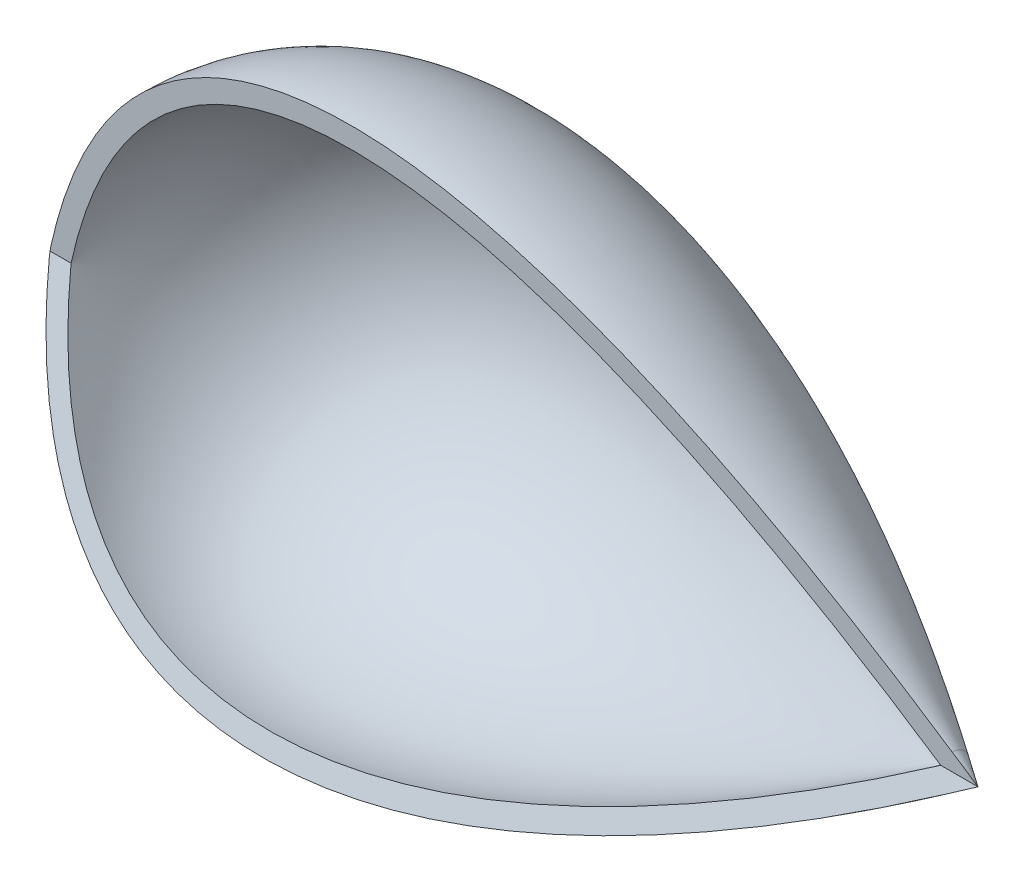
ISO-10303-21;
HEADER;
FILE_DESCRIPTION(('STEP AP214'),'2;1');
FILE_NAME('part.step','',(''),(''),'','','');
FILE_SCHEMA(('AUTOMOTIVE_DESIGN { 1 0 10303 214 1 1 1 1 }'));
ENDSEC;
DATA;
#1=APPLICATION_CONTEXT('core data for automotive mechanical design processes');
#2=APPLICATION_PROTOCOL_DEFINITION('international standard','automotive_design',2000,#1);
#3=PRODUCT_CONTEXT('',#1,'mechanical');
#4=PRODUCT('Part','Part','',(#3));
#5=PRODUCT_RELATED_PRODUCT_CATEGORY('part','',(#4));
#6=PRODUCT_DEFINITION_FORMATION('','',#4);
#7=PRODUCT_DEFINITION_CONTEXT('part definition',#1,'design');
#8=PRODUCT_DEFINITION('design','',#6,#7);
#9=PRODUCT_DEFINITION_SHAPE('','',#8);
#10=(LENGTH_UNIT() NAMED_UNIT(*) SI_UNIT(.MILLI.,.METRE.));
#11=(NAMED_UNIT(*) PLANE_ANGLE_UNIT() SI_UNIT($,.RADIAN.));
#12=(NAMED_UNIT(*) SI_UNIT($,.STERADIAN.) SOLID_ANGLE_UNIT());
#13=UNCERTAINTY_MEASURE_WITH_UNIT(LENGTH_MEASURE(1.E-05),#10,'distance_accuracy_value','');
#14=(GEOMETRIC_REPRESENTATION_CONTEXT(3) GLOBAL_UNCERTAINTY_ASSIGNED_CONTEXT((#13)) GLOBAL_UNIT_ASSIGNED_CONTEXT((#10,
#11,#12)) REPRESENTATION_CONTEXT('',''));
#15=CARTESIAN_POINT('',(0.,0.,0.));
#16=DIRECTION('',(0.,0.,1.));
#17=DIRECTION('',(1.,0.,0.));
#18=AXIS2_PLACEMENT_3D('',#15,#16,#17);
#19=CARTESIAN_POINT('',(0.,0.,0.));
#20=CARTESIAN_POINT('',(12.2665974326981,-52.2143831515935,19.0044812677512));
#21=CARTESIAN_POINT('',(71.2857509561671,-38.9899401088934,14.1911776354595));
#22=CARTESIAN_POINT('',(133.35,0.,0.));
#23=B_SPLINE_CURVE_WITH_KNOTS('',3,(#19,#20,#21,#22),.UNSPECIFIED.,.F.,.F.,(4,4),(0.,1.),.UNSPECIFIED.);
#24=CARTESIAN_POINT('',(79.375,0.,0.));
#25=DIRECTION('',(1.,0.,0.));
#26=AXIS1_PLACEMENT('',#24,#25);
#27=SURFACE_OF_REVOLUTION('',#23,#26);
#28=CARTESIAN_POINT('',(0.,0.,0.));
#29=CARTESIAN_POINT('',(12.2665974326981,55.5653859534667,0.));
#30=CARTESIAN_POINT('',(71.2857509561671,41.4922276140515,0.));
#31=CARTESIAN_POINT('',(133.35,0.,0.));
#32=B_SPLINE_CURVE_WITH_KNOTS('',3,(#28,#29,#30,#31),.UNSPECIFIED.,.F.,.F.,(4,4),(0.,1.),.UNSPECIFIED.);
#33=CARTESIAN_POINT('',(0.,0.,0.));
#34=VERTEX_POINT('',#33);
#35=CARTESIAN_POINT('',(133.35,0.,0.));
#36=VERTEX_POINT('',#35);
#37=EDGE_CURVE('E47',#34,#36,#32,.T.);
#38=ORIENTED_EDGE('',*,*,#37,.F.);
#39=EDGE_CURVE('E93',#34,#36,#23,.T.);
#40=ORIENTED_EDGE('',*,*,#39,.T.);
#41=EDGE_LOOP('',(#38,#40));
#42=FACE_BOUND('',#41,.T.);
#43=ADVANCED_FACE('F33',(#42),#27,.F.);
#44=CARTESIAN_POINT('',(139.06273317902,0.,0.));
#45=DIRECTION('',(-1.,0.,0.));
#46=DIRECTION('',(0.,-1.,0.));
#47=AXIS2_PLACEMENT_3D('',#44,#45,#46);
#48=CONICAL_SURFACE('',#47,0.,0.589296117846862);
#49=CARTESIAN_POINT('',(135.114588802611,0.,0.));
#50=DIRECTION('',(1.,0.,0.));
#51=DIRECTION('',(0.,1.,0.));
#52=AXIS2_PLACEMENT_3D('',#49,#50,#51);
#53=CIRCLE('',#52,2.63947937247127);
#54=CARTESIAN_POINT('',(135.114588802611,-2.48029928902786,0.902755113277788));
#55=VERTEX_POINT('',#54);
#56=CARTESIAN_POINT('',(135.114588802611,2.63947937247127,0.));
#57=VERTEX_POINT('',#56);
#58=EDGE_CURVE('E11',#55,#57,#53,.T.);
#59=ORIENTED_EDGE('',*,*,#58,.T.);
#60=DIRECTION('',(-0.831332085817748,0.555776000822195,0.));
#61=VECTOR('',#60,1.);
#62=CARTESIAN_POINT('',(135.114588802611,2.63947937247127,0.));
#63=LINE('',#62,#61);
#64=CARTESIAN_POINT('',(139.06273317902,0.,0.));
#65=VERTEX_POINT('',#64);
#66=EDGE_CURVE('E75',#65,#57,#63,.T.);
#67=ORIENTED_EDGE('',*,*,#66,.F.);
#68=DIRECTION('',(-0.831332085817748,-0.522258606782518,0.190086587458178));
#69=VECTOR('',#68,1.);
#70=CARTESIAN_POINT('',(135.114588802611,-2.48029928902786,0.902755113277788));
#71=LINE('',#70,#69);
#72=EDGE_CURVE('E78',#65,#55,#71,.T.);
#73=ORIENTED_EDGE('',*,*,#72,.T.);
#74=EDGE_LOOP('',(#59,#67,#73));
#75=FACE_BOUND('',#74,.T.);
#76=ADVANCED_FACE('F35',(#75),#48,.T.);
#77=CARTESIAN_POINT('',(135.114588802611,-2.48029928902786,0.902755113277788));
#78=CARTESIAN_POINT('',(133.174021898379,-3.69940027774414,1.34647158573502));
#79=CARTESIAN_POINT('',(129.247941256843,-6.11887982696693,2.22709012406795));
#80=CARTESIAN_POINT('',(121.478569850755,-10.7147774057499,3.8998600424811));
#81=CARTESIAN_POINT('',(111.824851294531,-16.0588974737043,5.8449606755612));
#82=CARTESIAN_POINT('',(100.429620723896,-21.7498536973906,7.91629934549506));
#83=CARTESIAN_POINT('',(89.2724377493746,-26.6666146170565,9.7058539692568));
#84=CARTESIAN_POINT('',(78.4128848442724,-30.7485076719002,11.1915415406779));
#85=CARTESIAN_POINT('',(64.4016644108154,-34.9968189608178,12.737800395741));
#86=CARTESIAN_POINT('',(47.8993522081506,-37.9127879025918,13.7991262945915));
#87=CARTESIAN_POINT('',(33.0629548691592,-37.1507841222349,13.5217796001432));
#88=CARTESIAN_POINT('',(22.4707576121305,-33.9569499779195,12.3593190384293));
#89=CARTESIAN_POINT('',(15.2920937800169,-30.1804581534362,10.9847884243678));
#90=CARTESIAN_POINT('',(9.02552718373551,-24.9791762043659,9.09167661488002));
#91=CARTESIAN_POINT('',(4.66942728106173,-19.4624819920647,7.08376413005369));
#92=CARTESIAN_POINT('',(1.73908742405049,-14.3454977617987,5.22133418102726));
#93=CARTESIAN_POINT('',(-0.176603866943816,-10.1567686544803,3.6967614665589));
#94=CARTESIAN_POINT('',(-1.53632442065836,-6.3646182236525,2.31653158587779));
#95=CARTESIAN_POINT('',(-2.47691994591209,-3.16263491115361,1.15110496951107));
#96=CARTESIAN_POINT('',(-2.9039047551631,-1.47935598302412,0.538441543704407));
#97=CARTESIAN_POINT('',(-3.10035112155177,-0.643156221873223,0.234089720744965));
#98=B_SPLINE_CURVE_WITH_KNOTS('',3,(#77,#78,#79,#80,#81,#82,#83,#84,#85,#86,#87,#88,#89,#90,#91,
#92,#93,#94,#95,#96,#97),.UNSPECIFIED.,.F.,.F.,(4,1,1,1,1,1,1,1,1,1,1,1,1,1,1,1,1,1,4),(0.,
0.03125,0.0625,0.125,0.1875,0.25,0.3125,0.375,0.5,0.625,0.6875,0.75,0.8125,0.875,0.90625,0.9375,
0.96875,0.984375,1.),.UNSPECIFIED.);
#99=CARTESIAN_POINT('',(79.375,0.,0.));
#100=DIRECTION('',(1.,0.,0.));
#101=AXIS1_PLACEMENT('',#99,#100);
#102=SURFACE_OF_REVOLUTION('',#98,#101);
#103=CARTESIAN_POINT('',(-3.10035112155177,0.,0.));
#104=DIRECTION('',(1.,0.,0.));
#105=DIRECTION('',(0.,1.,0.));
#106=AXIS2_PLACEMENT_3D('',#103,#104,#105);
#107=CIRCLE('',#106,0.684432555547063);
#108=CARTESIAN_POINT('',(-3.10035112155177,-0.643156221873225,0.234089720744965));
#109=VERTEX_POINT('',#108);
#110=CARTESIAN_POINT('',(-3.10035112155177,0.684432555547054,0.));
#111=VERTEX_POINT('',#110);
#112=EDGE_CURVE('E41',#109,#111,#107,.T.);
#113=ORIENTED_EDGE('',*,*,#112,.T.);
#114=CARTESIAN_POINT('',(135.114588802611,2.63947937247127,0.));
#115=CARTESIAN_POINT('',(133.174021898379,3.93681954706656,0.));
#116=CARTESIAN_POINT('',(129.247941256843,6.51157590430949,0.));
#117=CARTESIAN_POINT('',(121.478569850755,11.4024279522262,0.));
#118=CARTESIAN_POINT('',(111.824851294531,17.0895217419857,0.));
#119=CARTESIAN_POINT('',(100.429620723896,23.1457108593661,0.));
#120=CARTESIAN_POINT('',(89.2724377493746,28.3780185426528,0.));
#121=CARTESIAN_POINT('',(78.4128848442724,32.7218784012414,0.));
#122=CARTESIAN_POINT('',(64.4016644108154,37.2428368454659,0.));
#123=CARTESIAN_POINT('',(47.8993522081506,40.3459461785319,0.));
#124=CARTESIAN_POINT('',(33.0629548691592,39.5350386929335,0.));
#125=CARTESIAN_POINT('',(22.4707576121305,36.1362313875784,0.));
#126=CARTESIAN_POINT('',(15.2920937800168,32.1173727300263,0.));
#127=CARTESIAN_POINT('',(9.02552718373551,26.5822840914455,0.));
#128=CARTESIAN_POINT('',(4.66942728106172,20.711540733168,0.));
#129=CARTESIAN_POINT('',(1.73908742405049,15.2661598532091,0.));
#130=CARTESIAN_POINT('',(-0.176603866943819,10.808607442278,0.));
#131=CARTESIAN_POINT('',(-1.53632442065836,6.77308524390612,0.));
#132=CARTESIAN_POINT('',(-2.47691994591209,3.36560577490599,0.));
#133=CARTESIAN_POINT('',(-2.9039047551631,1.57429775471351,0.));
#134=CARTESIAN_POINT('',(-3.10035112155177,0.684432555547053,0.));
#135=B_SPLINE_CURVE_WITH_KNOTS('',3,(#114,#115,#116,#117,#118,#119,#120,#121,#122,#123,#124,
#125,#126,#127,#128,#129,#130,#131,#132,#133,#134),.UNSPECIFIED.,.F.,.F.,(4,1,1,1,1,1,1,1,1,1,1,
1,1,1,1,1,1,1,4),(0.,0.03125,0.0625,0.125,0.1875,0.25,0.3125,0.375,0.5,0.625,0.6875,0.75,0.8125,
0.875,0.90625,0.9375,0.96875,0.984375,1.),.UNSPECIFIED.);
#136=EDGE_CURVE('E86',#57,#111,#135,.T.);
#137=ORIENTED_EDGE('',*,*,#136,.F.);
#138=ORIENTED_EDGE('',*,*,#58,.F.);
#139=EDGE_CURVE('E121',#55,#109,#98,.T.);
#140=ORIENTED_EDGE('',*,*,#139,.T.);
#141=EDGE_LOOP('',(#113,#137,#138,#140));
#142=FACE_BOUND('',#141,.T.);
#143=ADVANCED_FACE('F90',(#142),#102,.F.);
#144=CARTESIAN_POINT('',(3.10035112155179,-0.684432555547057,0.));
#145=DIRECTION('',(0.,0.,-1.));
#146=DIRECTION('',(0.,1.,0.));
#147=AXIS2_PLACEMENT_3D('',#144,#145,#146);
#148=CIRCLE('',#147,6.35000000000002);
#149=TRIMMED_CURVE('',#148,(PARAMETER_VALUE(-1.46280187511274)),
(PARAMETER_VALUE(1.46280187511274)),.T.,.PARAMETER.);
#150=CARTESIAN_POINT('',(3.10035112155179,0.,0.));
#151=DIRECTION('',(1.,0.,0.));
#152=AXIS1_PLACEMENT('',#150,#151);
#153=SURFACE_OF_REVOLUTION('',#149,#152);
#154=CARTESIAN_POINT('',(3.10035112155179,-0.684432555547057,0.));
#155=DIRECTION('',(0.,0.,1.));
#156=DIRECTION('',(1.,0.,0.));
#157=AXIS2_PLACEMENT_3D('',#154,#155,#156);
#158=CIRCLE('',#157,6.35000000000002);
#159=CARTESIAN_POINT('',(-3.21265545827272,0.,0.));
#160=VERTEX_POINT('',#159);
#161=EDGE_CURVE('E91',#111,#160,#158,.T.);
#162=ORIENTED_EDGE('',*,*,#161,.F.);
#163=ORIENTED_EDGE('',*,*,#112,.F.);
#164=CARTESIAN_POINT('',(3.10035112155179,0.643156221873192,-0.23408972074496));
#165=DIRECTION('',(0.,-0.342020143325676,-0.939692620785906));
#166=DIRECTION('',(1.,0.,0.));
#167=AXIS2_PLACEMENT_3D('',#164,#165,#166);
#168=CIRCLE('',#167,6.35000000000002);
#169=EDGE_CURVE('E126',#109,#160,#168,.T.);
#170=ORIENTED_EDGE('',*,*,#169,.T.);
#171=EDGE_LOOP('',(#162,#163,#170));
#172=FACE_BOUND('',#171,.T.);
#173=ADVANCED_FACE('F116',(#172),#153,.T.);
#174=CARTESIAN_POINT('',(48.0008806458245,-34.2016212226826,12.448372088704));
#175=DIRECTION('',(0.,-0.342020143325676,-0.939692620785906));
#176=DIRECTION('',(1.,0.,0.));
#177=AXIS2_PLACEMENT_3D('',#174,#175,#176);
#178=PLANE('',#177);
#179=ORIENTED_EDGE('',*,*,#39,.F.);
#180=DIRECTION('',(1.,0.,0.));
#181=VECTOR('',#180,1.);
#182=CARTESIAN_POINT('',(-3.21265545827272,0.,0.));
#183=LINE('',#182,#181);
#184=EDGE_CURVE('E54',#160,#34,#183,.T.);
#185=ORIENTED_EDGE('',*,*,#184,.F.);
#186=ORIENTED_EDGE('',*,*,#169,.F.);
#187=ORIENTED_EDGE('',*,*,#139,.F.);
#188=ORIENTED_EDGE('',*,*,#72,.F.);
#189=DIRECTION('',(1.,0.,0.));
#190=VECTOR('',#189,1.);
#191=CARTESIAN_POINT('',(139.06273317902,0.,0.));
#192=LINE('',#191,#190);
#193=EDGE_CURVE('E88',#36,#65,#192,.T.);
#194=ORIENTED_EDGE('',*,*,#193,.F.);
#195=EDGE_LOOP('',(#179,#185,#186,#187,#188,#194));
#196=FACE_BOUND('',#195,.T.);
#197=ADVANCED_FACE('F114',(#196),#178,.F.);
#198=CARTESIAN_POINT('',(48.0008806458245,36.3966050878193,0.));
#199=DIRECTION('',(0.,0.,1.));
#200=DIRECTION('',(1.,0.,0.));
#201=AXIS2_PLACEMENT_3D('',#198,#199,#200);
#202=PLANE('',#201);
#203=ORIENTED_EDGE('',*,*,#37,.T.);
#204=ORIENTED_EDGE('',*,*,#193,.T.);
#205=ORIENTED_EDGE('',*,*,#66,.T.);
#206=ORIENTED_EDGE('',*,*,#136,.T.);
#207=ORIENTED_EDGE('',*,*,#161,.T.);
#208=ORIENTED_EDGE('',*,*,#184,.T.);
#209=EDGE_LOOP('',(#203,#204,#205,#206,#207,#208));
#210=FACE_BOUND('',#209,.T.);
#211=ADVANCED_FACE('F85',(#210),#202,.T.);
#212=CLOSED_SHELL('',(#43,#76,#143,#173,#197,#211));
#213=MANIFOLD_SOLID_BREP('B2',#212);
#214=ADVANCED_BREP_SHAPE_REPRESENTATION('',(#18,#213),#14);
#215=SHAPE_DEFINITION_REPRESENTATION(#9,#214);
ENDSEC;
END-ISO-10303-21;
